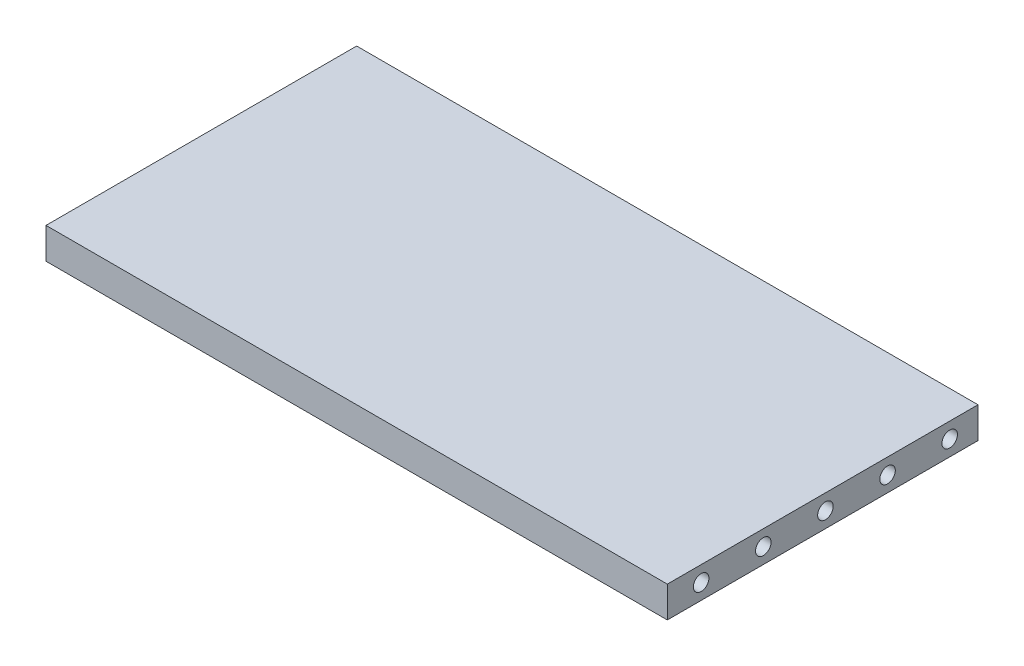
ISO-10303-21;
HEADER;
FILE_DESCRIPTION(('STEP AP214'),'2;1');
FILE_NAME('part.step','',(''),(''),'','','');
FILE_SCHEMA(('AUTOMOTIVE_DESIGN { 1 0 10303 214 1 1 1 1 }'));
ENDSEC;
DATA;
#1=APPLICATION_CONTEXT('core data for automotive mechanical design processes');
#2=APPLICATION_PROTOCOL_DEFINITION('international standard','automotive_design',2000,#1);
#3=PRODUCT_CONTEXT('',#1,'mechanical');
#4=PRODUCT('Part','Part','',(#3));
#5=PRODUCT_RELATED_PRODUCT_CATEGORY('part','',(#4));
#6=PRODUCT_DEFINITION_FORMATION('','',#4);
#7=PRODUCT_DEFINITION_CONTEXT('part definition',#1,'design');
#8=PRODUCT_DEFINITION('design','',#6,#7);
#9=PRODUCT_DEFINITION_SHAPE('','',#8);
#10=(LENGTH_UNIT() NAMED_UNIT(*) SI_UNIT(.MILLI.,.METRE.));
#11=(NAMED_UNIT(*) PLANE_ANGLE_UNIT() SI_UNIT($,.RADIAN.));
#12=(NAMED_UNIT(*) SI_UNIT($,.STERADIAN.) SOLID_ANGLE_UNIT());
#13=UNCERTAINTY_MEASURE_WITH_UNIT(LENGTH_MEASURE(1.E-05),#10,'distance_accuracy_value','');
#14=(GEOMETRIC_REPRESENTATION_CONTEXT(3) GLOBAL_UNCERTAINTY_ASSIGNED_CONTEXT((#13)) GLOBAL_UNIT_ASSIGNED_CONTEXT((#10,
#11,#12)) REPRESENTATION_CONTEXT('',''));
#15=CARTESIAN_POINT('',(0.,0.,0.));
#16=DIRECTION('',(0.,0.,1.));
#17=DIRECTION('',(1.,0.,0.));
#18=AXIS2_PLACEMENT_3D('',#15,#16,#17);
#19=CARTESIAN_POINT('',(63.5,6.35,31.75));
#20=DIRECTION('',(-1.,0.,0.));
#21=DIRECTION('',(0.,0.,1.));
#22=AXIS2_PLACEMENT_3D('',#19,#20,#21);
#23=PLANE('',#22);
#24=CARTESIAN_POINT('',(63.5,3.175,-13.2629287122038));
#25=DIRECTION('',(-1.,0.,0.));
#26=DIRECTION('',(0.,0.,1.));
#27=AXIS2_PLACEMENT_3D('',#24,#25,#26);
#28=CIRCLE('',#27,1.5875);
#29=CARTESIAN_POINT('',(63.5,3.175,-11.6754287122038));
#30=VERTEX_POINT('',#29);
#31=EDGE_CURVE('E251',#30,#30,#28,.F.);
#32=ORIENTED_EDGE('',*,*,#31,.F.);
#33=EDGE_LOOP('',(#32));
#34=FACE_BOUND('',#33,.T.);
#35=CARTESIAN_POINT('',(63.5,3.175,-25.9629287122038));
#36=DIRECTION('',(-1.,0.,0.));
#37=DIRECTION('',(0.,0.,1.));
#38=AXIS2_PLACEMENT_3D('',#35,#36,#37);
#39=CIRCLE('',#38,1.5875);
#40=CARTESIAN_POINT('',(63.5,3.175,-24.3754287122038));
#41=VERTEX_POINT('',#40);
#42=EDGE_CURVE('E109',#41,#41,#39,.F.);
#43=ORIENTED_EDGE('',*,*,#42,.F.);
#44=EDGE_LOOP('',(#43));
#45=FACE_BOUND('',#44,.T.);
#46=DIRECTION('',(0.,0.,-1.));
#47=VECTOR('',#46,1.);
#48=CARTESIAN_POINT('',(63.5,0.,31.75));
#49=LINE('',#48,#47);
#50=CARTESIAN_POINT('',(63.5,0.,31.75));
#51=VERTEX_POINT('',#50);
#52=CARTESIAN_POINT('',(63.5,0.,-31.75));
#53=VERTEX_POINT('',#52);
#54=EDGE_CURVE('E106',#51,#53,#49,.T.);
#55=ORIENTED_EDGE('',*,*,#54,.T.);
#56=DIRECTION('',(0.,-1.,0.));
#57=VECTOR('',#56,1.);
#58=CARTESIAN_POINT('',(63.5,6.35,-31.75));
#59=LINE('',#58,#57);
#60=CARTESIAN_POINT('',(63.5,6.35,-31.75));
#61=VERTEX_POINT('',#60);
#62=EDGE_CURVE('E96',#61,#53,#59,.T.);
#63=ORIENTED_EDGE('',*,*,#62,.F.);
#64=DIRECTION('',(0.,0.,-1.));
#65=VECTOR('',#64,1.);
#66=CARTESIAN_POINT('',(63.5,6.35,31.75));
#67=LINE('',#66,#65);
#68=CARTESIAN_POINT('',(63.5,6.35,31.75));
#69=VERTEX_POINT('',#68);
#70=EDGE_CURVE('E90',#69,#61,#67,.T.);
#71=ORIENTED_EDGE('',*,*,#70,.F.);
#72=DIRECTION('',(0.,-1.,0.));
#73=VECTOR('',#72,1.);
#74=CARTESIAN_POINT('',(63.5,6.35,31.75));
#75=LINE('',#74,#73);
#76=EDGE_CURVE('E102',#69,#51,#75,.T.);
#77=ORIENTED_EDGE('',*,*,#76,.T.);
#78=EDGE_LOOP('',(#55,#63,#71,#77));
#79=FACE_BOUND('',#78,.T.);
#80=CARTESIAN_POINT('',(63.5,3.175,-0.562928712203849));
#81=DIRECTION('',(-1.,0.,0.));
#82=DIRECTION('',(0.,0.,1.));
#83=AXIS2_PLACEMENT_3D('',#80,#81,#82);
#84=CIRCLE('',#83,1.5875);
#85=CARTESIAN_POINT('',(63.5,3.175,1.02457128779615));
#86=VERTEX_POINT('',#85);
#87=EDGE_CURVE('E119',#86,#86,#84,.F.);
#88=ORIENTED_EDGE('',*,*,#87,.F.);
#89=EDGE_LOOP('',(#88));
#90=FACE_BOUND('',#89,.T.);
#91=CARTESIAN_POINT('',(63.5,3.175,12.1370712877961));
#92=DIRECTION('',(-1.,0.,0.));
#93=DIRECTION('',(0.,0.,1.));
#94=AXIS2_PLACEMENT_3D('',#91,#92,#93);
#95=CIRCLE('',#94,1.5875);
#96=CARTESIAN_POINT('',(63.5,3.175,13.7245712877961));
#97=VERTEX_POINT('',#96);
#98=EDGE_CURVE('E125',#97,#97,#95,.F.);
#99=ORIENTED_EDGE('',*,*,#98,.F.);
#100=EDGE_LOOP('',(#99));
#101=FACE_BOUND('',#100,.T.);
#102=CARTESIAN_POINT('',(63.5,3.175,24.8370712877961));
#103=DIRECTION('',(-1.,0.,0.));
#104=DIRECTION('',(0.,0.,1.));
#105=AXIS2_PLACEMENT_3D('',#102,#103,#104);
#106=CIRCLE('',#105,1.5875);
#107=CARTESIAN_POINT('',(63.5,3.175,26.4245712877961));
#108=VERTEX_POINT('',#107);
#109=EDGE_CURVE('E11',#108,#108,#106,.F.);
#110=ORIENTED_EDGE('',*,*,#109,.F.);
#111=EDGE_LOOP('',(#110));
#112=FACE_BOUND('',#111,.T.);
#113=ADVANCED_FACE('F37',(#34,#45,#79,#90,#101,#112),#23,.F.);
#114=CARTESIAN_POINT('',(-63.5,6.35,-31.75));
#115=DIRECTION('',(0.,0.,1.));
#116=DIRECTION('',(1.,0.,0.));
#117=AXIS2_PLACEMENT_3D('',#114,#115,#116);
#118=PLANE('',#117);
#119=DIRECTION('',(-1.,0.,0.));
#120=VECTOR('',#119,1.);
#121=CARTESIAN_POINT('',(-63.5,0.,-31.75));
#122=LINE('',#121,#120);
#123=CARTESIAN_POINT('',(-63.5,0.,-31.75));
#124=VERTEX_POINT('',#123);
#125=EDGE_CURVE('E95',#53,#124,#122,.T.);
#126=ORIENTED_EDGE('',*,*,#125,.T.);
#127=DIRECTION('',(0.,-1.,0.));
#128=VECTOR('',#127,1.);
#129=CARTESIAN_POINT('',(-63.5,6.35,-31.75));
#130=LINE('',#129,#128);
#131=CARTESIAN_POINT('',(-63.5,6.35,-31.75));
#132=VERTEX_POINT('',#131);
#133=EDGE_CURVE('E93',#132,#124,#130,.T.);
#134=ORIENTED_EDGE('',*,*,#133,.F.);
#135=DIRECTION('',(-1.,0.,0.));
#136=VECTOR('',#135,1.);
#137=CARTESIAN_POINT('',(-63.5,6.35,-31.75));
#138=LINE('',#137,#136);
#139=EDGE_CURVE('E85',#61,#132,#138,.T.);
#140=ORIENTED_EDGE('',*,*,#139,.F.);
#141=ORIENTED_EDGE('',*,*,#62,.T.);
#142=EDGE_LOOP('',(#126,#134,#140,#141));
#143=FACE_BOUND('',#142,.T.);
#144=ADVANCED_FACE('F94',(#143),#118,.F.);
#145=CARTESIAN_POINT('',(-63.5,6.35,31.75));
#146=DIRECTION('',(1.,0.,0.));
#147=DIRECTION('',(0.,0.,-1.));
#148=AXIS2_PLACEMENT_3D('',#145,#146,#147);
#149=PLANE('',#148);
#150=CARTESIAN_POINT('',(-63.5,3.175,-13.2629287122038));
#151=DIRECTION('',(-1.,0.,0.));
#152=DIRECTION('',(0.,0.,1.));
#153=AXIS2_PLACEMENT_3D('',#150,#151,#152);
#154=CIRCLE('',#153,1.5875);
#155=CARTESIAN_POINT('',(-63.5,3.175,-11.6754287122038));
#156=VERTEX_POINT('',#155);
#157=EDGE_CURVE('E254',#156,#156,#154,.T.);
#158=ORIENTED_EDGE('',*,*,#157,.F.);
#159=EDGE_LOOP('',(#158));
#160=FACE_BOUND('',#159,.T.);
#161=CARTESIAN_POINT('',(-63.5,3.175,-25.9629287122038));
#162=DIRECTION('',(-1.,0.,0.));
#163=DIRECTION('',(0.,0.,1.));
#164=AXIS2_PLACEMENT_3D('',#161,#162,#163);
#165=CIRCLE('',#164,1.5875);
#166=CARTESIAN_POINT('',(-63.5,3.175,-24.3754287122038));
#167=VERTEX_POINT('',#166);
#168=EDGE_CURVE('E248',#167,#167,#165,.T.);
#169=ORIENTED_EDGE('',*,*,#168,.F.);
#170=EDGE_LOOP('',(#169));
#171=FACE_BOUND('',#170,.T.);
#172=DIRECTION('',(0.,0.,1.));
#173=VECTOR('',#172,1.);
#174=CARTESIAN_POINT('',(-63.5,0.,31.75));
#175=LINE('',#174,#173);
#176=CARTESIAN_POINT('',(-63.5,0.,31.75));
#177=VERTEX_POINT('',#176);
#178=EDGE_CURVE('E71',#124,#177,#175,.T.);
#179=ORIENTED_EDGE('',*,*,#178,.T.);
#180=DIRECTION('',(0.,-1.,0.));
#181=VECTOR('',#180,1.);
#182=CARTESIAN_POINT('',(-63.5,6.35,31.75));
#183=LINE('',#182,#181);
#184=CARTESIAN_POINT('',(-63.5,6.35,31.75));
#185=VERTEX_POINT('',#184);
#186=EDGE_CURVE('E97',#185,#177,#183,.T.);
#187=ORIENTED_EDGE('',*,*,#186,.F.);
#188=DIRECTION('',(0.,0.,1.));
#189=VECTOR('',#188,1.);
#190=CARTESIAN_POINT('',(-63.5,6.35,31.75));
#191=LINE('',#190,#189);
#192=EDGE_CURVE('E88',#132,#185,#191,.T.);
#193=ORIENTED_EDGE('',*,*,#192,.F.);
#194=ORIENTED_EDGE('',*,*,#133,.T.);
#195=EDGE_LOOP('',(#179,#187,#193,#194));
#196=FACE_BOUND('',#195,.T.);
#197=CARTESIAN_POINT('',(-63.5,3.175,-0.562928712203849));
#198=DIRECTION('',(-1.,0.,0.));
#199=DIRECTION('',(0.,0.,1.));
#200=AXIS2_PLACEMENT_3D('',#197,#198,#199);
#201=CIRCLE('',#200,1.5875);
#202=CARTESIAN_POINT('',(-63.5,3.175,1.02457128779615));
#203=VERTEX_POINT('',#202);
#204=EDGE_CURVE('E116',#203,#203,#201,.T.);
#205=ORIENTED_EDGE('',*,*,#204,.F.);
#206=EDGE_LOOP('',(#205));
#207=FACE_BOUND('',#206,.T.);
#208=CARTESIAN_POINT('',(-63.5,3.175,12.1370712877961));
#209=DIRECTION('',(-1.,0.,0.));
#210=DIRECTION('',(0.,0.,1.));
#211=AXIS2_PLACEMENT_3D('',#208,#209,#210);
#212=CIRCLE('',#211,1.5875);
#213=CARTESIAN_POINT('',(-63.5,3.175,13.7245712877961));
#214=VERTEX_POINT('',#213);
#215=EDGE_CURVE('E122',#214,#214,#212,.T.);
#216=ORIENTED_EDGE('',*,*,#215,.F.);
#217=EDGE_LOOP('',(#216));
#218=FACE_BOUND('',#217,.T.);
#219=CARTESIAN_POINT('',(-63.5,3.175,24.8370712877961));
#220=DIRECTION('',(-1.,0.,0.));
#221=DIRECTION('',(0.,0.,1.));
#222=AXIS2_PLACEMENT_3D('',#219,#220,#221);
#223=CIRCLE('',#222,1.5875);
#224=CARTESIAN_POINT('',(-63.5,3.175,26.4245712877961));
#225=VERTEX_POINT('',#224);
#226=EDGE_CURVE('E46',#225,#225,#223,.T.);
#227=ORIENTED_EDGE('',*,*,#226,.F.);
#228=EDGE_LOOP('',(#227));
#229=FACE_BOUND('',#228,.T.);
#230=ADVANCED_FACE('F99',(#160,#171,#196,#207,#218,#229),#149,.F.);
#231=CARTESIAN_POINT('',(-63.5,6.35,31.75));
#232=DIRECTION('',(0.,0.,-1.));
#233=DIRECTION('',(-1.,0.,0.));
#234=AXIS2_PLACEMENT_3D('',#231,#232,#233);
#235=PLANE('',#234);
#236=DIRECTION('',(1.,0.,0.));
#237=VECTOR('',#236,1.);
#238=CARTESIAN_POINT('',(-63.5,0.,31.75));
#239=LINE('',#238,#237);
#240=EDGE_CURVE('E77',#177,#51,#239,.T.);
#241=ORIENTED_EDGE('',*,*,#240,.T.);
#242=ORIENTED_EDGE('',*,*,#76,.F.);
#243=DIRECTION('',(1.,0.,0.));
#244=VECTOR('',#243,1.);
#245=CARTESIAN_POINT('',(-63.5,6.35,31.75));
#246=LINE('',#245,#244);
#247=EDGE_CURVE('E54',#185,#69,#246,.T.);
#248=ORIENTED_EDGE('',*,*,#247,.F.);
#249=ORIENTED_EDGE('',*,*,#186,.T.);
#250=EDGE_LOOP('',(#241,#242,#248,#249));
#251=FACE_BOUND('',#250,.T.);
#252=ADVANCED_FACE('F133',(#251),#235,.F.);
#253=CARTESIAN_POINT('',(0.,6.35,0.));
#254=DIRECTION('',(0.,-1.,0.));
#255=DIRECTION('',(0.,0.,-1.));
#256=AXIS2_PLACEMENT_3D('',#253,#254,#255);
#257=PLANE('',#256);
#258=ORIENTED_EDGE('',*,*,#70,.T.);
#259=ORIENTED_EDGE('',*,*,#139,.T.);
#260=ORIENTED_EDGE('',*,*,#192,.T.);
#261=ORIENTED_EDGE('',*,*,#247,.T.);
#262=EDGE_LOOP('',(#258,#259,#260,#261));
#263=FACE_BOUND('',#262,.T.);
#264=ADVANCED_FACE('F86',(#263),#257,.F.);
#265=CARTESIAN_POINT('',(0.,0.,0.));
#266=DIRECTION('',(0.,-1.,0.));
#267=DIRECTION('',(0.,0.,-1.));
#268=AXIS2_PLACEMENT_3D('',#265,#266,#267);
#269=PLANE('',#268);
#270=ORIENTED_EDGE('',*,*,#54,.F.);
#271=ORIENTED_EDGE('',*,*,#240,.F.);
#272=ORIENTED_EDGE('',*,*,#178,.F.);
#273=ORIENTED_EDGE('',*,*,#125,.F.);
#274=EDGE_LOOP('',(#270,#271,#272,#273));
#275=FACE_BOUND('',#274,.T.);
#276=ADVANCED_FACE('F200',(#275),#269,.T.);
#277=CARTESIAN_POINT('',(63.501,3.175,-25.9629287122038));
#278=DIRECTION('',(-1.,0.,0.));
#279=DIRECTION('',(0.,0.,1.));
#280=AXIS2_PLACEMENT_3D('',#277,#278,#279);
#281=CYLINDRICAL_SURFACE('',#280,1.5875);
#282=ORIENTED_EDGE('',*,*,#168,.T.);
#283=EDGE_LOOP('',(#282));
#284=FACE_BOUND('',#283,.T.);
#285=ORIENTED_EDGE('',*,*,#42,.T.);
#286=EDGE_LOOP('',(#285));
#287=FACE_BOUND('',#286,.T.);
#288=ADVANCED_FACE('F190',(#284,#287),#281,.F.);
#289=CARTESIAN_POINT('',(63.501,3.175,-13.2629287122038));
#290=DIRECTION('',(-1.,0.,0.));
#291=DIRECTION('',(0.,0.,1.));
#292=AXIS2_PLACEMENT_3D('',#289,#290,#291);
#293=CYLINDRICAL_SURFACE('',#292,1.5875);
#294=ORIENTED_EDGE('',*,*,#157,.T.);
#295=EDGE_LOOP('',(#294));
#296=FACE_BOUND('',#295,.T.);
#297=ORIENTED_EDGE('',*,*,#31,.T.);
#298=EDGE_LOOP('',(#297));
#299=FACE_BOUND('',#298,.T.);
#300=ADVANCED_FACE('F157',(#296,#299),#293,.F.);
#301=CARTESIAN_POINT('',(63.501,3.175,-0.562928712203849));
#302=DIRECTION('',(-1.,0.,0.));
#303=DIRECTION('',(0.,0.,1.));
#304=AXIS2_PLACEMENT_3D('',#301,#302,#303);
#305=CYLINDRICAL_SURFACE('',#304,1.5875);
#306=ORIENTED_EDGE('',*,*,#204,.T.);
#307=EDGE_LOOP('',(#306));
#308=FACE_BOUND('',#307,.T.);
#309=ORIENTED_EDGE('',*,*,#87,.T.);
#310=EDGE_LOOP('',(#309));
#311=FACE_BOUND('',#310,.T.);
#312=ADVANCED_FACE('F154',(#308,#311),#305,.F.);
#313=CARTESIAN_POINT('',(63.501,3.175,12.1370712877961));
#314=DIRECTION('',(-1.,0.,0.));
#315=DIRECTION('',(0.,0.,1.));
#316=AXIS2_PLACEMENT_3D('',#313,#314,#315);
#317=CYLINDRICAL_SURFACE('',#316,1.5875);
#318=ORIENTED_EDGE('',*,*,#215,.T.);
#319=EDGE_LOOP('',(#318));
#320=FACE_BOUND('',#319,.T.);
#321=ORIENTED_EDGE('',*,*,#98,.T.);
#322=EDGE_LOOP('',(#321));
#323=FACE_BOUND('',#322,.T.);
#324=ADVANCED_FACE('F156',(#320,#323),#317,.F.);
#325=CARTESIAN_POINT('',(63.501,3.175,24.8370712877961));
#326=DIRECTION('',(-1.,0.,0.));
#327=DIRECTION('',(0.,0.,1.));
#328=AXIS2_PLACEMENT_3D('',#325,#326,#327);
#329=CYLINDRICAL_SURFACE('',#328,1.5875);
#330=ORIENTED_EDGE('',*,*,#226,.T.);
#331=EDGE_LOOP('',(#330));
#332=FACE_BOUND('',#331,.T.);
#333=ORIENTED_EDGE('',*,*,#109,.T.);
#334=EDGE_LOOP('',(#333));
#335=FACE_BOUND('',#334,.T.);
#336=ADVANCED_FACE('F39',(#332,#335),#329,.F.);
#337=CLOSED_SHELL('',(#113,#144,#230,#252,#264,#276,#288,#300,#312,#324,#336));
#338=MANIFOLD_SOLID_BREP('B2',#337);
#339=ADVANCED_BREP_SHAPE_REPRESENTATION('',(#18,#338),#14);
#340=SHAPE_DEFINITION_REPRESENTATION(#9,#339);
ENDSEC;
END-ISO-10303-21;
